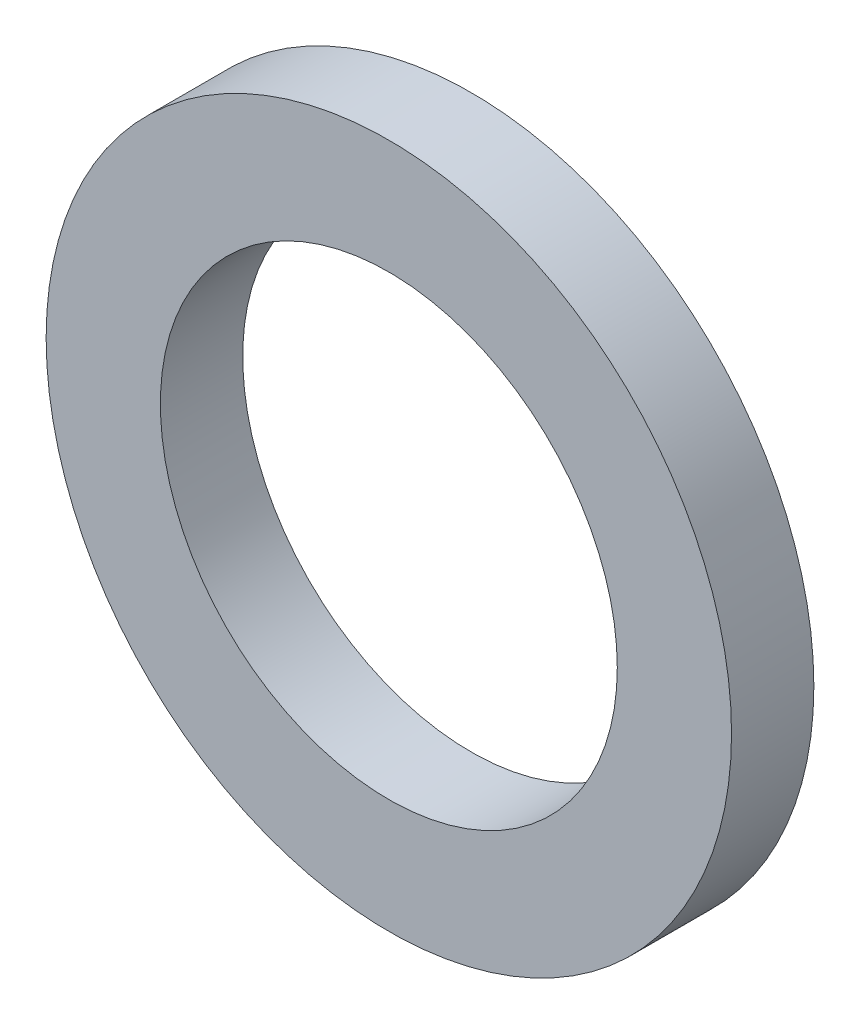
ISO-10303-21;
HEADER;
FILE_DESCRIPTION(('STEP AP214'),'2;1');
FILE_NAME('part.step','',(''),(''),'','','');
FILE_SCHEMA(('AUTOMOTIVE_DESIGN { 1 0 10303 214 1 1 1 1 }'));
ENDSEC;
DATA;
#1=APPLICATION_CONTEXT('core data for automotive mechanical design processes');
#2=APPLICATION_PROTOCOL_DEFINITION('international standard','automotive_design',2000,#1);
#3=PRODUCT_CONTEXT('',#1,'mechanical');
#4=PRODUCT('Part','Part','',(#3));
#5=PRODUCT_RELATED_PRODUCT_CATEGORY('part','',(#4));
#6=PRODUCT_DEFINITION_FORMATION('','',#4);
#7=PRODUCT_DEFINITION_CONTEXT('part definition',#1,'design');
#8=PRODUCT_DEFINITION('design','',#6,#7);
#9=PRODUCT_DEFINITION_SHAPE('','',#8);
#10=(LENGTH_UNIT() NAMED_UNIT(*) SI_UNIT(.MILLI.,.METRE.));
#11=(NAMED_UNIT(*) PLANE_ANGLE_UNIT() SI_UNIT($,.RADIAN.));
#12=(NAMED_UNIT(*) SI_UNIT($,.STERADIAN.) SOLID_ANGLE_UNIT());
#13=UNCERTAINTY_MEASURE_WITH_UNIT(LENGTH_MEASURE(1.E-05),#10,'distance_accuracy_value','');
#14=(GEOMETRIC_REPRESENTATION_CONTEXT(3) GLOBAL_UNCERTAINTY_ASSIGNED_CONTEXT((#13)) GLOBAL_UNIT_ASSIGNED_CONTEXT((#10,
#11,#12)) REPRESENTATION_CONTEXT('',''));
#15=CARTESIAN_POINT('',(0.,0.,0.));
#16=DIRECTION('',(0.,0.,1.));
#17=DIRECTION('',(1.,0.,0.));
#18=AXIS2_PLACEMENT_3D('',#15,#16,#17);
#19=CARTESIAN_POINT('',(0.,0.,0.));
#20=DIRECTION('',(0.,0.,-1.));
#21=DIRECTION('',(1.,0.,0.));
#22=AXIS2_PLACEMENT_3D('',#19,#20,#21);
#23=CYLINDRICAL_SURFACE('',#22,0.83250024);
#24=CARTESIAN_POINT('',(0.,0.,0.1999996));
#25=DIRECTION('',(0.,0.,1.));
#26=DIRECTION('',(1.,0.,0.));
#27=AXIS2_PLACEMENT_3D('',#24,#25,#26);
#28=CIRCLE('',#27,0.83250024);
#29=CARTESIAN_POINT('',(0.83250024,0.,0.1999996));
#30=VERTEX_POINT('',#29);
#31=EDGE_CURVE('E11',#30,#30,#28,.T.);
#32=ORIENTED_EDGE('',*,*,#31,.F.);
#33=DIRECTION('',(0.,0.,1.));
#34=VECTOR('',#33,1.);
#35=CARTESIAN_POINT('',(0.83250024,0.,0.));
#36=LINE('',#35,#34);
#37=CARTESIAN_POINT('',(0.83250024,0.,0.));
#38=VERTEX_POINT('',#37);
#39=EDGE_CURVE('E24',#38,#30,#36,.T.);
#40=ORIENTED_EDGE('',*,*,#39,.F.);
#41=CARTESIAN_POINT('',(0.,0.,0.));
#42=DIRECTION('',(0.,0.,1.));
#43=DIRECTION('',(1.,0.,0.));
#44=AXIS2_PLACEMENT_3D('',#41,#42,#43);
#45=CIRCLE('',#44,0.83250024);
#46=EDGE_CURVE('E46',#38,#38,#45,.T.);
#47=ORIENTED_EDGE('',*,*,#46,.T.);
#48=ORIENTED_EDGE('',*,*,#39,.T.);
#49=EDGE_LOOP('',(#32,#40,#47,#48));
#50=FACE_BOUND('',#49,.T.);
#51=ADVANCED_FACE('F17',(#50),#23,.T.);
#52=CARTESIAN_POINT('',(0.,0.,0.));
#53=DIRECTION('',(0.,0.,-1.));
#54=DIRECTION('',(1.,0.,0.));
#55=AXIS2_PLACEMENT_3D('',#52,#53,#54);
#56=CYLINDRICAL_SURFACE('',#55,0.55500016);
#57=DIRECTION('',(0.,0.,1.));
#58=VECTOR('',#57,1.);
#59=CARTESIAN_POINT('',(0.55500016,0.,0.));
#60=LINE('',#59,#58);
#61=CARTESIAN_POINT('',(0.55500016,0.,0.));
#62=VERTEX_POINT('',#61);
#63=CARTESIAN_POINT('',(0.55500016,0.,0.1999996));
#64=VERTEX_POINT('',#63);
#65=EDGE_CURVE('E40',#62,#64,#60,.T.);
#66=ORIENTED_EDGE('',*,*,#65,.T.);
#67=CARTESIAN_POINT('',(0.,0.,0.1999996));
#68=DIRECTION('',(0.,0.,1.));
#69=DIRECTION('',(1.,0.,0.));
#70=AXIS2_PLACEMENT_3D('',#67,#68,#69);
#71=CIRCLE('',#70,0.55500016);
#72=EDGE_CURVE('E45',#64,#64,#71,.T.);
#73=ORIENTED_EDGE('',*,*,#72,.T.);
#74=ORIENTED_EDGE('',*,*,#65,.F.);
#75=CARTESIAN_POINT('',(0.,0.,0.));
#76=DIRECTION('',(0.,0.,1.));
#77=DIRECTION('',(1.,0.,0.));
#78=AXIS2_PLACEMENT_3D('',#75,#76,#77);
#79=CIRCLE('',#78,0.55500016);
#80=EDGE_CURVE('E43',#62,#62,#79,.T.);
#81=ORIENTED_EDGE('',*,*,#80,.F.);
#82=EDGE_LOOP('',(#66,#73,#74,#81));
#83=FACE_BOUND('',#82,.T.);
#84=ADVANCED_FACE('F42',(#83),#56,.F.);
#85=CARTESIAN_POINT('',(0.83250024,0.,0.));
#86=DIRECTION('',(0.,0.,-1.));
#87=DIRECTION('',(-1.,0.,0.));
#88=AXIS2_PLACEMENT_3D('',#85,#86,#87);
#89=PLANE('',#88);
#90=ORIENTED_EDGE('',*,*,#46,.F.);
#91=EDGE_LOOP('',(#90));
#92=FACE_BOUND('',#91,.T.);
#93=ORIENTED_EDGE('',*,*,#80,.T.);
#94=EDGE_LOOP('',(#93));
#95=FACE_BOUND('',#94,.T.);
#96=ADVANCED_FACE('F49',(#92,#95),#89,.T.);
#97=CARTESIAN_POINT('',(0.83250024,0.,0.1999996));
#98=DIRECTION('',(0.,0.,-1.));
#99=DIRECTION('',(-1.,0.,0.));
#100=AXIS2_PLACEMENT_3D('',#97,#98,#99);
#101=PLANE('',#100);
#102=ORIENTED_EDGE('',*,*,#31,.T.);
#103=EDGE_LOOP('',(#102));
#104=FACE_BOUND('',#103,.T.);
#105=ORIENTED_EDGE('',*,*,#72,.F.);
#106=EDGE_LOOP('',(#105));
#107=FACE_BOUND('',#106,.T.);
#108=ADVANCED_FACE('F56',(#104,#107),#101,.F.);
#109=CLOSED_SHELL('',(#51,#84,#96,#108));
#110=MANIFOLD_SOLID_BREP('B1',#109);
#111=ADVANCED_BREP_SHAPE_REPRESENTATION('',(#18,#110),#14);
#112=SHAPE_DEFINITION_REPRESENTATION(#9,#111);
ENDSEC;
END-ISO-10303-21;
